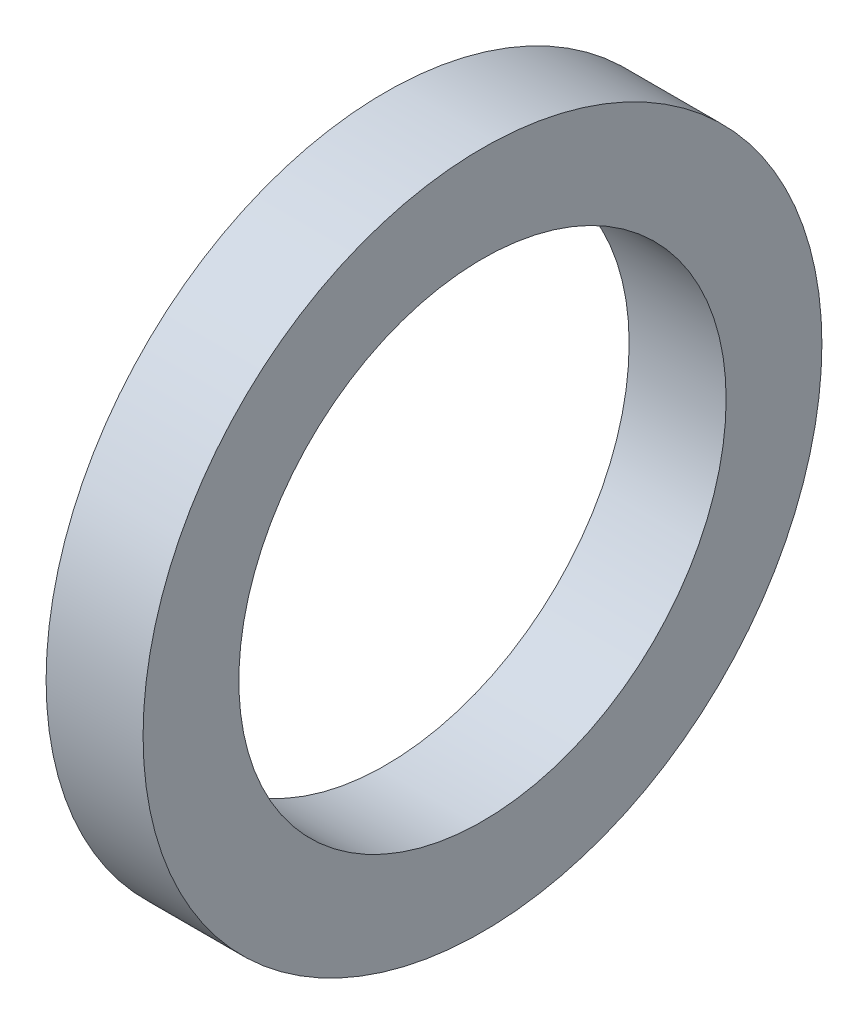
ISO-10303-21;
HEADER;
FILE_DESCRIPTION(('STEP AP214'),'2;1');
FILE_NAME('part.step','',(''),(''),'','','');
FILE_SCHEMA(('AUTOMOTIVE_DESIGN { 1 0 10303 214 1 1 1 1 }'));
ENDSEC;
DATA;
#1=APPLICATION_CONTEXT('core data for automotive mechanical design processes');
#2=APPLICATION_PROTOCOL_DEFINITION('international standard','automotive_design',2000,#1);
#3=PRODUCT_CONTEXT('',#1,'mechanical');
#4=PRODUCT('Part','Part','',(#3));
#5=PRODUCT_RELATED_PRODUCT_CATEGORY('part','',(#4));
#6=PRODUCT_DEFINITION_FORMATION('','',#4);
#7=PRODUCT_DEFINITION_CONTEXT('part definition',#1,'design');
#8=PRODUCT_DEFINITION('design','',#6,#7);
#9=PRODUCT_DEFINITION_SHAPE('','',#8);
#10=(LENGTH_UNIT() NAMED_UNIT(*) SI_UNIT(.MILLI.,.METRE.));
#11=(NAMED_UNIT(*) PLANE_ANGLE_UNIT() SI_UNIT($,.RADIAN.));
#12=(NAMED_UNIT(*) SI_UNIT($,.STERADIAN.) SOLID_ANGLE_UNIT());
#13=UNCERTAINTY_MEASURE_WITH_UNIT(LENGTH_MEASURE(1.E-05),#10,'distance_accuracy_value','');
#14=(GEOMETRIC_REPRESENTATION_CONTEXT(3) GLOBAL_UNCERTAINTY_ASSIGNED_CONTEXT((#13)) GLOBAL_UNIT_ASSIGNED_CONTEXT((#10,
#11,#12)) REPRESENTATION_CONTEXT('',''));
#15=CARTESIAN_POINT('',(0.,0.,0.));
#16=DIRECTION('',(0.,0.,1.));
#17=DIRECTION('',(1.,0.,0.));
#18=AXIS2_PLACEMENT_3D('',#15,#16,#17);
#19=CARTESIAN_POINT('',(4.,0.,0.));
#20=DIRECTION('',(1.,0.,0.));
#21=DIRECTION('',(0.,0.,-1.));
#22=AXIS2_PLACEMENT_3D('',#19,#20,#21);
#23=PLANE('',#22);
#24=CARTESIAN_POINT('',(4.,0.,0.));
#25=DIRECTION('',(1.,0.,0.));
#26=DIRECTION('',(0.,0.,-1.));
#27=AXIS2_PLACEMENT_3D('',#24,#25,#26);
#28=CIRCLE('',#27,14.);
#29=CARTESIAN_POINT('',(4.,0.,-14.));
#30=VERTEX_POINT('',#29);
#31=EDGE_CURVE('E10',#30,#30,#28,.T.);
#32=ORIENTED_EDGE('',*,*,#31,.T.);
#33=EDGE_LOOP('',(#32));
#34=FACE_BOUND('',#33,.T.);
#35=CARTESIAN_POINT('',(4.,0.,0.));
#36=DIRECTION('',(1.,0.,0.));
#37=DIRECTION('',(0.,0.,-1.));
#38=AXIS2_PLACEMENT_3D('',#35,#36,#37);
#39=CIRCLE('',#38,10.05);
#40=CARTESIAN_POINT('',(4.,0.,-10.05));
#41=VERTEX_POINT('',#40);
#42=EDGE_CURVE('E43',#41,#41,#39,.T.);
#43=ORIENTED_EDGE('',*,*,#42,.F.);
#44=EDGE_LOOP('',(#43));
#45=FACE_BOUND('',#44,.T.);
#46=ADVANCED_FACE('F32',(#34,#45),#23,.T.);
#47=CARTESIAN_POINT('',(0.,0.,0.));
#48=DIRECTION('',(1.,0.,0.));
#49=DIRECTION('',(0.,0.,-1.));
#50=AXIS2_PLACEMENT_3D('',#47,#48,#49);
#51=PLANE('',#50);
#52=CARTESIAN_POINT('',(0.,0.,0.));
#53=DIRECTION('',(1.,0.,0.));
#54=DIRECTION('',(0.,0.,-1.));
#55=AXIS2_PLACEMENT_3D('',#52,#53,#54);
#56=CIRCLE('',#55,14.);
#57=CARTESIAN_POINT('',(0.,0.,-14.));
#58=VERTEX_POINT('',#57);
#59=EDGE_CURVE('E36',#58,#58,#56,.T.);
#60=ORIENTED_EDGE('',*,*,#59,.F.);
#61=EDGE_LOOP('',(#60));
#62=FACE_BOUND('',#61,.T.);
#63=CARTESIAN_POINT('',(0.,0.,0.));
#64=DIRECTION('',(1.,0.,0.));
#65=DIRECTION('',(0.,0.,-1.));
#66=AXIS2_PLACEMENT_3D('',#63,#64,#65);
#67=CIRCLE('',#66,10.05);
#68=CARTESIAN_POINT('',(0.,0.,-10.05));
#69=VERTEX_POINT('',#68);
#70=EDGE_CURVE('E45',#69,#69,#67,.T.);
#71=ORIENTED_EDGE('',*,*,#70,.T.);
#72=EDGE_LOOP('',(#71));
#73=FACE_BOUND('',#72,.T.);
#74=ADVANCED_FACE('F55',(#62,#73),#51,.F.);
#75=CARTESIAN_POINT('',(4.,0.,0.));
#76=DIRECTION('',(-1.,0.,0.));
#77=DIRECTION('',(0.,0.,1.));
#78=AXIS2_PLACEMENT_3D('',#75,#76,#77);
#79=CYLINDRICAL_SURFACE('',#78,14.);
#80=ORIENTED_EDGE('',*,*,#31,.F.);
#81=EDGE_LOOP('',(#80));
#82=FACE_BOUND('',#81,.T.);
#83=ORIENTED_EDGE('',*,*,#59,.T.);
#84=EDGE_LOOP('',(#83));
#85=FACE_BOUND('',#84,.T.);
#86=ADVANCED_FACE('F34',(#82,#85),#79,.T.);
#87=CARTESIAN_POINT('',(4.,0.,0.));
#88=DIRECTION('',(-1.,0.,0.));
#89=DIRECTION('',(0.,0.,1.));
#90=AXIS2_PLACEMENT_3D('',#87,#88,#89);
#91=CYLINDRICAL_SURFACE('',#90,10.05);
#92=ORIENTED_EDGE('',*,*,#42,.T.);
#93=EDGE_LOOP('',(#92));
#94=FACE_BOUND('',#93,.T.);
#95=ORIENTED_EDGE('',*,*,#70,.F.);
#96=EDGE_LOOP('',(#95));
#97=FACE_BOUND('',#96,.T.);
#98=ADVANCED_FACE('F51',(#94,#97),#91,.F.);
#99=CLOSED_SHELL('',(#46,#74,#86,#98));
#100=MANIFOLD_SOLID_BREP('B2',#99);
#101=ADVANCED_BREP_SHAPE_REPRESENTATION('',(#18,#100),#14);
#102=SHAPE_DEFINITION_REPRESENTATION(#9,#101);
ENDSEC;
END-ISO-10303-21;
